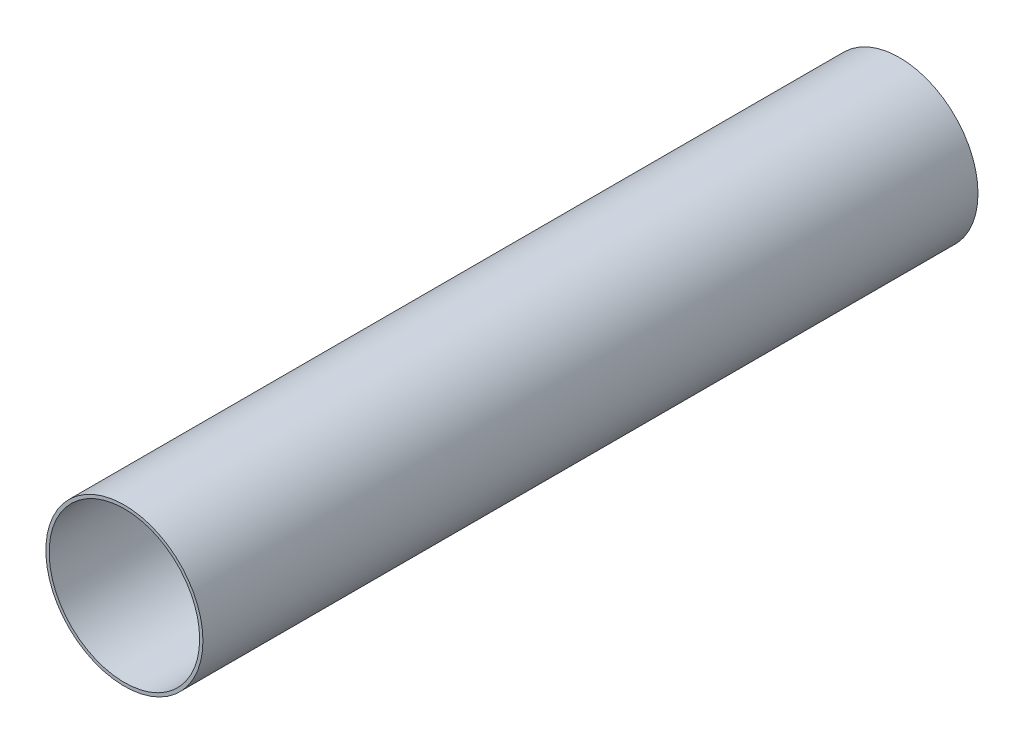
ISO-10303-21;
HEADER;
FILE_DESCRIPTION(('STEP AP214'),'2;1');
FILE_NAME('part.step','',(''),(''),'','','');
FILE_SCHEMA(('AUTOMOTIVE_DESIGN { 1 0 10303 214 1 1 1 1 }'));
ENDSEC;
DATA;
#1=APPLICATION_CONTEXT('core data for automotive mechanical design processes');
#2=APPLICATION_PROTOCOL_DEFINITION('international standard','automotive_design',2000,#1);
#3=PRODUCT_CONTEXT('',#1,'mechanical');
#4=PRODUCT('Part','Part','',(#3));
#5=PRODUCT_RELATED_PRODUCT_CATEGORY('part','',(#4));
#6=PRODUCT_DEFINITION_FORMATION('','',#4);
#7=PRODUCT_DEFINITION_CONTEXT('part definition',#1,'design');
#8=PRODUCT_DEFINITION('design','',#6,#7);
#9=PRODUCT_DEFINITION_SHAPE('','',#8);
#10=(LENGTH_UNIT() NAMED_UNIT(*) SI_UNIT(.MILLI.,.METRE.));
#11=(NAMED_UNIT(*) PLANE_ANGLE_UNIT() SI_UNIT($,.RADIAN.));
#12=(NAMED_UNIT(*) SI_UNIT($,.STERADIAN.) SOLID_ANGLE_UNIT());
#13=UNCERTAINTY_MEASURE_WITH_UNIT(LENGTH_MEASURE(1.E-05),#10,'distance_accuracy_value','');
#14=(GEOMETRIC_REPRESENTATION_CONTEXT(3) GLOBAL_UNCERTAINTY_ASSIGNED_CONTEXT((#13)) GLOBAL_UNIT_ASSIGNED_CONTEXT((#10,
#11,#12)) REPRESENTATION_CONTEXT('',''));
#15=CARTESIAN_POINT('',(0.,0.,0.));
#16=DIRECTION('',(0.,0.,1.));
#17=DIRECTION('',(1.,0.,0.));
#18=AXIS2_PLACEMENT_3D('',#15,#16,#17);
#19=CARTESIAN_POINT('',(0.140137906301864,0.,542.8));
#20=DIRECTION('',(0.,0.,-1.));
#21=DIRECTION('',(-1.,0.,0.));
#22=AXIS2_PLACEMENT_3D('',#19,#20,#21);
#23=CYLINDRICAL_SURFACE('',#22,52.7);
#24=CARTESIAN_POINT('',(0.140137906301864,0.,542.8));
#25=DIRECTION('',(0.,0.,1.));
#26=DIRECTION('',(1.,0.,0.));
#27=AXIS2_PLACEMENT_3D('',#24,#25,#26);
#28=CIRCLE('',#27,52.7);
#29=CARTESIAN_POINT('',(52.8401379063019,0.,542.8));
#30=VERTEX_POINT('',#29);
#31=EDGE_CURVE('E38',#30,#30,#28,.T.);
#32=ORIENTED_EDGE('',*,*,#31,.T.);
#33=EDGE_LOOP('',(#32));
#34=FACE_BOUND('',#33,.T.);
#35=CARTESIAN_POINT('',(0.140137906301864,0.,0.));
#36=DIRECTION('',(0.,0.,1.));
#37=DIRECTION('',(1.,0.,0.));
#38=AXIS2_PLACEMENT_3D('',#35,#36,#37);
#39=CIRCLE('',#38,52.7);
#40=CARTESIAN_POINT('',(52.8401379063019,0.,0.));
#41=VERTEX_POINT('',#40);
#42=EDGE_CURVE('E44',#41,#41,#39,.T.);
#43=ORIENTED_EDGE('',*,*,#42,.F.);
#44=EDGE_LOOP('',(#43));
#45=FACE_BOUND('',#44,.T.);
#46=ADVANCED_FACE('F31',(#34,#45),#23,.F.);
#47=CARTESIAN_POINT('',(0.140137906301864,0.,542.8));
#48=DIRECTION('',(0.,0.,-1.));
#49=DIRECTION('',(-1.,0.,0.));
#50=AXIS2_PLACEMENT_3D('',#47,#48,#49);
#51=CYLINDRICAL_SURFACE('',#50,55.);
#52=CARTESIAN_POINT('',(0.140137906301864,0.,542.8));
#53=DIRECTION('',(0.,0.,1.));
#54=DIRECTION('',(1.,0.,0.));
#55=AXIS2_PLACEMENT_3D('',#52,#53,#54);
#56=CIRCLE('',#55,55.);
#57=CARTESIAN_POINT('',(55.1401379063019,0.,542.8));
#58=VERTEX_POINT('',#57);
#59=EDGE_CURVE('E10',#58,#58,#56,.T.);
#60=ORIENTED_EDGE('',*,*,#59,.F.);
#61=EDGE_LOOP('',(#60));
#62=FACE_BOUND('',#61,.T.);
#63=CARTESIAN_POINT('',(0.140137906301864,0.,0.));
#64=DIRECTION('',(0.,0.,1.));
#65=DIRECTION('',(1.,0.,0.));
#66=AXIS2_PLACEMENT_3D('',#63,#64,#65);
#67=CIRCLE('',#66,55.);
#68=CARTESIAN_POINT('',(55.1401379063019,0.,0.));
#69=VERTEX_POINT('',#68);
#70=EDGE_CURVE('E34',#69,#69,#67,.T.);
#71=ORIENTED_EDGE('',*,*,#70,.T.);
#72=EDGE_LOOP('',(#71));
#73=FACE_BOUND('',#72,.T.);
#74=ADVANCED_FACE('F51',(#62,#73),#51,.T.);
#75=CARTESIAN_POINT('',(0.,0.,542.8));
#76=DIRECTION('',(0.,0.,1.));
#77=DIRECTION('',(1.,0.,0.));
#78=AXIS2_PLACEMENT_3D('',#75,#76,#77);
#79=PLANE('',#78);
#80=ORIENTED_EDGE('',*,*,#31,.F.);
#81=EDGE_LOOP('',(#80));
#82=FACE_BOUND('',#81,.T.);
#83=ORIENTED_EDGE('',*,*,#59,.T.);
#84=EDGE_LOOP('',(#83));
#85=FACE_BOUND('',#84,.T.);
#86=ADVANCED_FACE('F55',(#82,#85),#79,.T.);
#87=CARTESIAN_POINT('',(0.,0.,0.));
#88=DIRECTION('',(0.,0.,1.));
#89=DIRECTION('',(1.,0.,0.));
#90=AXIS2_PLACEMENT_3D('',#87,#88,#89);
#91=PLANE('',#90);
#92=ORIENTED_EDGE('',*,*,#42,.T.);
#93=EDGE_LOOP('',(#92));
#94=FACE_BOUND('',#93,.T.);
#95=ORIENTED_EDGE('',*,*,#70,.F.);
#96=EDGE_LOOP('',(#95));
#97=FACE_BOUND('',#96,.T.);
#98=ADVANCED_FACE('F53',(#94,#97),#91,.F.);
#99=CLOSED_SHELL('',(#46,#74,#86,#98));
#100=MANIFOLD_SOLID_BREP('B2',#99);
#101=ADVANCED_BREP_SHAPE_REPRESENTATION('',(#18,#100),#14);
#102=SHAPE_DEFINITION_REPRESENTATION(#9,#101);
ENDSEC;
END-ISO-10303-21;
